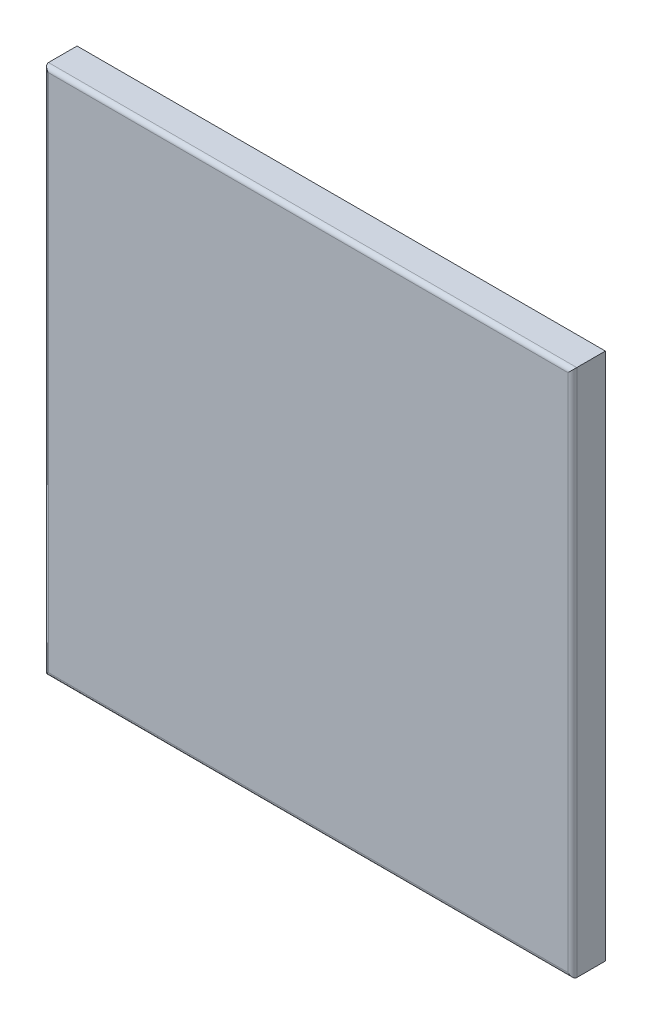
ISO-10303-21;
HEADER;
FILE_DESCRIPTION(('STEP AP214'),'2;1');
FILE_NAME('part.step','',(''),(''),'','','');
FILE_SCHEMA(('AUTOMOTIVE_DESIGN { 1 0 10303 214 1 1 1 1 }'));
ENDSEC;
DATA;
#1=APPLICATION_CONTEXT('core data for automotive mechanical design processes');
#2=APPLICATION_PROTOCOL_DEFINITION('international standard','automotive_design',2000,#1);
#3=PRODUCT_CONTEXT('',#1,'mechanical');
#4=PRODUCT('Part','Part','',(#3));
#5=PRODUCT_RELATED_PRODUCT_CATEGORY('part','',(#4));
#6=PRODUCT_DEFINITION_FORMATION('','',#4);
#7=PRODUCT_DEFINITION_CONTEXT('part definition',#1,'design');
#8=PRODUCT_DEFINITION('design','',#6,#7);
#9=PRODUCT_DEFINITION_SHAPE('','',#8);
#10=(LENGTH_UNIT() NAMED_UNIT(*) SI_UNIT(.MILLI.,.METRE.));
#11=(NAMED_UNIT(*) PLANE_ANGLE_UNIT() SI_UNIT($,.RADIAN.));
#12=(NAMED_UNIT(*) SI_UNIT($,.STERADIAN.) SOLID_ANGLE_UNIT());
#13=UNCERTAINTY_MEASURE_WITH_UNIT(LENGTH_MEASURE(1.E-05),#10,'distance_accuracy_value','');
#14=(GEOMETRIC_REPRESENTATION_CONTEXT(3) GLOBAL_UNCERTAINTY_ASSIGNED_CONTEXT((#13)) GLOBAL_UNIT_ASSIGNED_CONTEXT((#10,
#11,#12)) REPRESENTATION_CONTEXT('',''));
#15=CARTESIAN_POINT('',(0.,0.,0.));
#16=DIRECTION('',(0.,0.,1.));
#17=DIRECTION('',(1.,0.,0.));
#18=AXIS2_PLACEMENT_3D('',#15,#16,#17);
#19=CARTESIAN_POINT('',(152.4,-152.4,2.54));
#20=DIRECTION('',(-1.,0.,0.));
#21=DIRECTION('',(0.,0.,1.));
#22=AXIS2_PLACEMENT_3D('',#19,#20,#21);
#23=PLANE('',#22);
#24=DIRECTION('',(0.,0.,-1.));
#25=VECTOR('',#24,1.);
#26=CARTESIAN_POINT('',(152.4,152.4,2.54));
#27=LINE('',#26,#25);
#28=CARTESIAN_POINT('',(152.4,152.4,0.));
#29=VERTEX_POINT('',#28);
#30=CARTESIAN_POINT('',(152.4,152.4,-16.51));
#31=VERTEX_POINT('',#30);
#32=EDGE_CURVE('E169',#29,#31,#27,.T.);
#33=ORIENTED_EDGE('',*,*,#32,.F.);
#34=DIRECTION('',(0.,1.,0.));
#35=VECTOR('',#34,1.);
#36=CARTESIAN_POINT('',(152.4,-152.4,0.));
#37=LINE('',#36,#35);
#38=CARTESIAN_POINT('',(152.4,-152.4,0.));
#39=VERTEX_POINT('',#38);
#40=EDGE_CURVE('E196',#29,#39,#37,.F.);
#41=ORIENTED_EDGE('',*,*,#40,.T.);
#42=DIRECTION('',(0.,0.,-1.));
#43=VECTOR('',#42,1.);
#44=CARTESIAN_POINT('',(152.4,-152.4,2.54));
#45=LINE('',#44,#43);
#46=CARTESIAN_POINT('',(152.4,-152.4,-16.51));
#47=VERTEX_POINT('',#46);
#48=EDGE_CURVE('E163',#39,#47,#45,.T.);
#49=ORIENTED_EDGE('',*,*,#48,.T.);
#50=DIRECTION('',(0.,1.,0.));
#51=VECTOR('',#50,1.);
#52=CARTESIAN_POINT('',(152.4,-152.4,-16.51));
#53=LINE('',#52,#51);
#54=EDGE_CURVE('E153',#47,#31,#53,.T.);
#55=ORIENTED_EDGE('',*,*,#54,.T.);
#56=EDGE_LOOP('',(#33,#41,#49,#55));
#57=FACE_BOUND('',#56,.T.);
#58=ADVANCED_FACE('F33',(#57),#23,.F.);
#59=CARTESIAN_POINT('',(-152.4,152.4,2.54));
#60=DIRECTION('',(0.,-1.,0.));
#61=DIRECTION('',(0.,0.,-1.));
#62=AXIS2_PLACEMENT_3D('',#59,#60,#61);
#63=PLANE('',#62);
#64=DIRECTION('',(0.,0.,-1.));
#65=VECTOR('',#64,1.);
#66=CARTESIAN_POINT('',(-152.4,152.4,2.54));
#67=LINE('',#66,#65);
#68=CARTESIAN_POINT('',(-152.4,152.4,0.));
#69=VERTEX_POINT('',#68);
#70=CARTESIAN_POINT('',(-152.4,152.4,-16.51));
#71=VERTEX_POINT('',#70);
#72=EDGE_CURVE('E167',#69,#71,#67,.T.);
#73=ORIENTED_EDGE('',*,*,#72,.F.);
#74=DIRECTION('',(-1.,0.,0.));
#75=VECTOR('',#74,1.);
#76=CARTESIAN_POINT('',(-152.4,152.4,0.));
#77=LINE('',#76,#75);
#78=EDGE_CURVE('E194',#69,#29,#77,.F.);
#79=ORIENTED_EDGE('',*,*,#78,.T.);
#80=ORIENTED_EDGE('',*,*,#32,.T.);
#81=DIRECTION('',(-1.,0.,0.));
#82=VECTOR('',#81,1.);
#83=CARTESIAN_POINT('',(152.4,152.4,-16.51));
#84=LINE('',#83,#82);
#85=EDGE_CURVE('E157',#31,#71,#84,.T.);
#86=ORIENTED_EDGE('',*,*,#85,.T.);
#87=EDGE_LOOP('',(#73,#79,#80,#86));
#88=FACE_BOUND('',#87,.T.);
#89=ADVANCED_FACE('F240',(#88),#63,.F.);
#90=CARTESIAN_POINT('',(-152.4,-152.4,2.54));
#91=DIRECTION('',(1.,0.,0.));
#92=DIRECTION('',(0.,0.,-1.));
#93=AXIS2_PLACEMENT_3D('',#90,#91,#92);
#94=PLANE('',#93);
#95=DIRECTION('',(0.,0.,-1.));
#96=VECTOR('',#95,1.);
#97=CARTESIAN_POINT('',(-152.4,-152.4,2.54));
#98=LINE('',#97,#96);
#99=CARTESIAN_POINT('',(-152.4,-152.4,0.));
#100=VERTEX_POINT('',#99);
#101=CARTESIAN_POINT('',(-152.4,-152.4,-16.51));
#102=VERTEX_POINT('',#101);
#103=EDGE_CURVE('E165',#100,#102,#98,.T.);
#104=ORIENTED_EDGE('',*,*,#103,.F.);
#105=DIRECTION('',(0.,-1.,0.));
#106=VECTOR('',#105,1.);
#107=CARTESIAN_POINT('',(-152.4,-152.4,0.));
#108=LINE('',#107,#106);
#109=EDGE_CURVE('E192',#100,#69,#108,.F.);
#110=ORIENTED_EDGE('',*,*,#109,.T.);
#111=ORIENTED_EDGE('',*,*,#72,.T.);
#112=DIRECTION('',(0.,-1.,0.));
#113=VECTOR('',#112,1.);
#114=CARTESIAN_POINT('',(-152.4,152.4,-16.51));
#115=LINE('',#114,#113);
#116=EDGE_CURVE('E160',#71,#102,#115,.T.);
#117=ORIENTED_EDGE('',*,*,#116,.T.);
#118=EDGE_LOOP('',(#104,#110,#111,#117));
#119=FACE_BOUND('',#118,.T.);
#120=ADVANCED_FACE('F230',(#119),#94,.F.);
#121=CARTESIAN_POINT('',(-152.4,-152.4,2.54));
#122=DIRECTION('',(0.,1.,0.));
#123=DIRECTION('',(0.,0.,1.));
#124=AXIS2_PLACEMENT_3D('',#121,#122,#123);
#125=PLANE('',#124);
#126=ORIENTED_EDGE('',*,*,#48,.F.);
#127=DIRECTION('',(1.,0.,0.));
#128=VECTOR('',#127,1.);
#129=CARTESIAN_POINT('',(-152.4,-152.4,0.));
#130=LINE('',#129,#128);
#131=EDGE_CURVE('E189',#39,#100,#130,.F.);
#132=ORIENTED_EDGE('',*,*,#131,.T.);
#133=ORIENTED_EDGE('',*,*,#103,.T.);
#134=DIRECTION('',(1.,0.,0.));
#135=VECTOR('',#134,1.);
#136=CARTESIAN_POINT('',(-152.4,-152.4,-16.51));
#137=LINE('',#136,#135);
#138=CARTESIAN_POINT('',(-149.86,-152.4,-16.51));
#139=VERTEX_POINT('',#138);
#140=EDGE_CURVE('E150',#102,#139,#137,.T.);
#141=ORIENTED_EDGE('',*,*,#140,.T.);
#142=CARTESIAN_POINT('',(149.86,-152.4,-16.51));
#143=VERTEX_POINT('',#142);
#144=EDGE_CURVE('E154',#139,#143,#137,.T.);
#145=ORIENTED_EDGE('',*,*,#144,.T.);
#146=EDGE_CURVE('E138',#143,#47,#137,.T.);
#147=ORIENTED_EDGE('',*,*,#146,.T.);
#148=EDGE_LOOP('',(#126,#132,#133,#141,#145,#147));
#149=FACE_BOUND('',#148,.T.);
#150=ADVANCED_FACE('F227',(#149),#125,.F.);
#151=CARTESIAN_POINT('',(0.,0.,2.54));
#152=DIRECTION('',(0.,0.,-1.));
#153=DIRECTION('',(-1.,0.,0.));
#154=AXIS2_PLACEMENT_3D('',#151,#152,#153);
#155=PLANE('',#154);
#156=DIRECTION('',(0.,-1.,0.));
#157=VECTOR('',#156,1.);
#158=CARTESIAN_POINT('',(-149.86,0.,2.54));
#159=LINE('',#158,#157);
#160=CARTESIAN_POINT('',(-149.86,149.86,2.54));
#161=VERTEX_POINT('',#160);
#162=CARTESIAN_POINT('',(-149.86,-149.86,2.54));
#163=VERTEX_POINT('',#162);
#164=EDGE_CURVE('E184',#161,#163,#159,.T.);
#165=ORIENTED_EDGE('',*,*,#164,.T.);
#166=DIRECTION('',(1.,0.,0.));
#167=VECTOR('',#166,1.);
#168=CARTESIAN_POINT('',(0.,-149.86,2.54));
#169=LINE('',#168,#167);
#170=CARTESIAN_POINT('',(149.86,-149.86,2.54));
#171=VERTEX_POINT('',#170);
#172=EDGE_CURVE('E186',#163,#171,#169,.T.);
#173=ORIENTED_EDGE('',*,*,#172,.T.);
#174=DIRECTION('',(0.,1.,0.));
#175=VECTOR('',#174,1.);
#176=CARTESIAN_POINT('',(149.86,0.,2.54));
#177=LINE('',#176,#175);
#178=CARTESIAN_POINT('',(149.86,149.86,2.54));
#179=VERTEX_POINT('',#178);
#180=EDGE_CURVE('E180',#171,#179,#177,.T.);
#181=ORIENTED_EDGE('',*,*,#180,.T.);
#182=DIRECTION('',(-1.,0.,0.));
#183=VECTOR('',#182,1.);
#184=CARTESIAN_POINT('',(0.,149.86,2.54));
#185=LINE('',#184,#183);
#186=EDGE_CURVE('E182',#179,#161,#185,.T.);
#187=ORIENTED_EDGE('',*,*,#186,.T.);
#188=EDGE_LOOP('',(#165,#173,#181,#187));
#189=FACE_BOUND('',#188,.T.);
#190=ADVANCED_FACE('F217',(#189),#155,.F.);
#191=CARTESIAN_POINT('',(0.,0.,-16.51));
#192=DIRECTION('',(0.,0.,1.));
#193=DIRECTION('',(1.,0.,0.));
#194=AXIS2_PLACEMENT_3D('',#191,#192,#193);
#195=PLANE('',#194);
#196=ORIENTED_EDGE('',*,*,#146,.F.);
#197=DIRECTION('',(0.,1.,0.));
#198=VECTOR('',#197,1.);
#199=CARTESIAN_POINT('',(149.86,-149.86,-16.51));
#200=LINE('',#199,#198);
#201=CARTESIAN_POINT('',(149.86,149.86,-16.51));
#202=VERTEX_POINT('',#201);
#203=EDGE_CURVE('E119',#143,#202,#200,.T.);
#204=ORIENTED_EDGE('',*,*,#203,.T.);
#205=DIRECTION('',(-1.,0.,0.));
#206=VECTOR('',#205,1.);
#207=CARTESIAN_POINT('',(149.86,149.86,-16.51));
#208=LINE('',#207,#206);
#209=CARTESIAN_POINT('',(-149.86,149.86,-16.51));
#210=VERTEX_POINT('',#209);
#211=EDGE_CURVE('E129',#202,#210,#208,.T.);
#212=ORIENTED_EDGE('',*,*,#211,.T.);
#213=DIRECTION('',(0.,-1.,0.));
#214=VECTOR('',#213,1.);
#215=CARTESIAN_POINT('',(-149.86,149.86,-16.51));
#216=LINE('',#215,#214);
#217=EDGE_CURVE('E125',#210,#139,#216,.T.);
#218=ORIENTED_EDGE('',*,*,#217,.T.);
#219=ORIENTED_EDGE('',*,*,#140,.F.);
#220=ORIENTED_EDGE('',*,*,#116,.F.);
#221=ORIENTED_EDGE('',*,*,#85,.F.);
#222=ORIENTED_EDGE('',*,*,#54,.F.);
#223=EDGE_LOOP('',(#196,#204,#212,#218,#219,#220,#221,#222));
#224=FACE_BOUND('',#223,.T.);
#225=ADVANCED_FACE('F135',(#224),#195,.F.);
#226=CARTESIAN_POINT('',(149.86,-149.86,-16.51));
#227=DIRECTION('',(1.,0.,0.));
#228=DIRECTION('',(0.,0.,-1.));
#229=AXIS2_PLACEMENT_3D('',#226,#227,#228);
#230=PLANE('',#229);
#231=DIRECTION('',(0.,-1.,0.));
#232=VECTOR('',#231,1.);
#233=CARTESIAN_POINT('',(149.86,0.,0.));
#234=LINE('',#233,#232);
#235=CARTESIAN_POINT('',(149.86,149.86,0.));
#236=VERTEX_POINT('',#235);
#237=CARTESIAN_POINT('',(149.86,-149.86,0.));
#238=VERTEX_POINT('',#237);
#239=EDGE_CURVE('E121',#236,#238,#234,.T.);
#240=ORIENTED_EDGE('',*,*,#239,.F.);
#241=DIRECTION('',(0.,0.,1.));
#242=VECTOR('',#241,1.);
#243=CARTESIAN_POINT('',(149.86,149.86,-16.51));
#244=LINE('',#243,#242);
#245=EDGE_CURVE('E115',#202,#236,#244,.T.);
#246=ORIENTED_EDGE('',*,*,#245,.F.);
#247=ORIENTED_EDGE('',*,*,#203,.F.);
#248=CARTESIAN_POINT('',(149.86,-152.4,-13.97));
#249=DIRECTION('',(1.,0.,0.));
#250=DIRECTION('',(0.,0.,-1.));
#251=AXIS2_PLACEMENT_3D('',#248,#249,#250);
#252=CIRCLE('',#251,2.54);
#253=CARTESIAN_POINT('',(149.86,-149.86,-13.97));
#254=VERTEX_POINT('',#253);
#255=EDGE_CURVE('E42',#143,#254,#252,.T.);
#256=ORIENTED_EDGE('',*,*,#255,.T.);
#257=DIRECTION('',(0.,0.,1.));
#258=VECTOR('',#257,1.);
#259=CARTESIAN_POINT('',(149.86,-149.86,-16.51));
#260=LINE('',#259,#258);
#261=EDGE_CURVE('E145',#254,#238,#260,.T.);
#262=ORIENTED_EDGE('',*,*,#261,.T.);
#263=EDGE_LOOP('',(#240,#246,#247,#256,#262));
#264=FACE_BOUND('',#263,.T.);
#265=ADVANCED_FACE('F117',(#264),#230,.F.);
#266=CARTESIAN_POINT('',(-149.86,-149.86,-16.51));
#267=DIRECTION('',(0.,-1.,0.));
#268=DIRECTION('',(1.,0.,0.));
#269=AXIS2_PLACEMENT_3D('',#266,#267,#268);
#270=PLANE('',#269);
#271=ORIENTED_EDGE('',*,*,#261,.F.);
#272=DIRECTION('',(1.,0.,0.));
#273=VECTOR('',#272,1.);
#274=CARTESIAN_POINT('',(-149.86,-149.86,-13.97));
#275=LINE('',#274,#273);
#276=CARTESIAN_POINT('',(-149.86,-149.86,-13.97));
#277=VERTEX_POINT('',#276);
#278=EDGE_CURVE('E50',#254,#277,#275,.F.);
#279=ORIENTED_EDGE('',*,*,#278,.T.);
#280=DIRECTION('',(0.,0.,1.));
#281=VECTOR('',#280,1.);
#282=CARTESIAN_POINT('',(-149.86,-149.86,-16.51));
#283=LINE('',#282,#281);
#284=CARTESIAN_POINT('',(-149.86,-149.86,0.));
#285=VERTEX_POINT('',#284);
#286=EDGE_CURVE('E147',#277,#285,#283,.T.);
#287=ORIENTED_EDGE('',*,*,#286,.T.);
#288=DIRECTION('',(-1.,0.,0.));
#289=VECTOR('',#288,1.);
#290=CARTESIAN_POINT('',(0.,-149.86,0.));
#291=LINE('',#290,#289);
#292=EDGE_CURVE('E176',#238,#285,#291,.T.);
#293=ORIENTED_EDGE('',*,*,#292,.F.);
#294=EDGE_LOOP('',(#271,#279,#287,#293));
#295=FACE_BOUND('',#294,.T.);
#296=ADVANCED_FACE('F282',(#295),#270,.F.);
#297=CARTESIAN_POINT('',(-149.86,149.86,-16.51));
#298=DIRECTION('',(-1.,0.,0.));
#299=DIRECTION('',(0.,-1.,0.));
#300=AXIS2_PLACEMENT_3D('',#297,#298,#299);
#301=PLANE('',#300);
#302=DIRECTION('',(0.,1.,0.));
#303=VECTOR('',#302,1.);
#304=CARTESIAN_POINT('',(-149.86,0.,0.));
#305=LINE('',#304,#303);
#306=CARTESIAN_POINT('',(-149.86,149.86,0.));
#307=VERTEX_POINT('',#306);
#308=EDGE_CURVE('E173',#285,#307,#305,.T.);
#309=ORIENTED_EDGE('',*,*,#308,.F.);
#310=ORIENTED_EDGE('',*,*,#286,.F.);
#311=CARTESIAN_POINT('',(-149.86,-152.4,-13.97));
#312=DIRECTION('',(-1.,0.,0.));
#313=DIRECTION('',(0.,-1.,0.));
#314=AXIS2_PLACEMENT_3D('',#311,#312,#313);
#315=CIRCLE('',#314,2.54);
#316=EDGE_CURVE('E11',#277,#139,#315,.T.);
#317=ORIENTED_EDGE('',*,*,#316,.T.);
#318=ORIENTED_EDGE('',*,*,#217,.F.);
#319=DIRECTION('',(0.,0.,1.));
#320=VECTOR('',#319,1.);
#321=CARTESIAN_POINT('',(-149.86,149.86,-16.51));
#322=LINE('',#321,#320);
#323=EDGE_CURVE('E124',#210,#307,#322,.T.);
#324=ORIENTED_EDGE('',*,*,#323,.T.);
#325=EDGE_LOOP('',(#309,#310,#317,#318,#324));
#326=FACE_BOUND('',#325,.T.);
#327=ADVANCED_FACE('F268',(#326),#301,.F.);
#328=CARTESIAN_POINT('',(149.86,149.86,-16.51));
#329=DIRECTION('',(0.,1.,0.));
#330=DIRECTION('',(-1.,0.,0.));
#331=AXIS2_PLACEMENT_3D('',#328,#329,#330);
#332=PLANE('',#331);
#333=DIRECTION('',(1.,0.,0.));
#334=VECTOR('',#333,1.);
#335=CARTESIAN_POINT('',(0.,149.86,0.));
#336=LINE('',#335,#334);
#337=EDGE_CURVE('E171',#307,#236,#336,.T.);
#338=ORIENTED_EDGE('',*,*,#337,.F.);
#339=ORIENTED_EDGE('',*,*,#323,.F.);
#340=ORIENTED_EDGE('',*,*,#211,.F.);
#341=ORIENTED_EDGE('',*,*,#245,.T.);
#342=EDGE_LOOP('',(#338,#339,#340,#341));
#343=FACE_BOUND('',#342,.T.);
#344=ADVANCED_FACE('F130',(#343),#332,.F.);
#345=CARTESIAN_POINT('',(0.,0.,0.));
#346=DIRECTION('',(0.,0.,-1.));
#347=DIRECTION('',(-1.,0.,0.));
#348=AXIS2_PLACEMENT_3D('',#345,#346,#347);
#349=PLANE('',#348);
#350=ORIENTED_EDGE('',*,*,#337,.T.);
#351=ORIENTED_EDGE('',*,*,#239,.T.);
#352=ORIENTED_EDGE('',*,*,#292,.T.);
#353=ORIENTED_EDGE('',*,*,#308,.T.);
#354=EDGE_LOOP('',(#350,#351,#352,#353));
#355=FACE_BOUND('',#354,.T.);
#356=ADVANCED_FACE('F259',(#355),#349,.T.);
#357=CARTESIAN_POINT('',(0.,149.86,0.));
#358=DIRECTION('',(-1.,0.,0.));
#359=DIRECTION('',(0.,0.,1.));
#360=AXIS2_PLACEMENT_3D('',#357,#358,#359);
#361=CYLINDRICAL_SURFACE('',#360,2.54);
#362=CARTESIAN_POINT('',(149.86,149.86,0.));
#363=DIRECTION('',(-0.707106781186547,0.707106781186547,0.));
#364=DIRECTION('',(0.707106781186547,0.707106781186547,0.));
#365=AXIS2_PLACEMENT_3D('',#362,#363,#364);
#366=ELLIPSE('',#365,3.59210244842766,2.54);
#367=EDGE_CURVE('E142',#29,#179,#366,.F.);
#368=ORIENTED_EDGE('',*,*,#367,.F.);
#369=ORIENTED_EDGE('',*,*,#78,.F.);
#370=CARTESIAN_POINT('',(-149.86,149.86,0.));
#371=DIRECTION('',(-0.707106781186547,-0.707106781186547,0.));
#372=DIRECTION('',(-0.707106781186547,0.707106781186547,0.));
#373=AXIS2_PLACEMENT_3D('',#370,#371,#372);
#374=ELLIPSE('',#373,3.59210244842766,2.54);
#375=EDGE_CURVE('E37',#161,#69,#374,.T.);
#376=ORIENTED_EDGE('',*,*,#375,.F.);
#377=ORIENTED_EDGE('',*,*,#186,.F.);
#378=EDGE_LOOP('',(#368,#369,#376,#377));
#379=FACE_BOUND('',#378,.T.);
#380=ADVANCED_FACE('F213',(#379),#361,.T.);
#381=CARTESIAN_POINT('',(-149.86,0.,0.));
#382=DIRECTION('',(0.,-1.,0.));
#383=DIRECTION('',(0.,0.,-1.));
#384=AXIS2_PLACEMENT_3D('',#381,#382,#383);
#385=CYLINDRICAL_SURFACE('',#384,2.54);
#386=ORIENTED_EDGE('',*,*,#375,.T.);
#387=ORIENTED_EDGE('',*,*,#109,.F.);
#388=CARTESIAN_POINT('',(-149.86,-149.86,0.));
#389=DIRECTION('',(0.707106781186547,-0.707106781186547,0.));
#390=DIRECTION('',(-0.707106781186547,-0.707106781186547,0.));
#391=AXIS2_PLACEMENT_3D('',#388,#389,#390);
#392=ELLIPSE('',#391,3.59210244842766,2.54);
#393=EDGE_CURVE('E202',#163,#100,#392,.T.);
#394=ORIENTED_EDGE('',*,*,#393,.F.);
#395=ORIENTED_EDGE('',*,*,#164,.F.);
#396=EDGE_LOOP('',(#386,#387,#394,#395));
#397=FACE_BOUND('',#396,.T.);
#398=ADVANCED_FACE('F255',(#397),#385,.T.);
#399=CARTESIAN_POINT('',(149.86,0.,0.));
#400=DIRECTION('',(0.,1.,0.));
#401=DIRECTION('',(0.,0.,1.));
#402=AXIS2_PLACEMENT_3D('',#399,#400,#401);
#403=CYLINDRICAL_SURFACE('',#402,2.54);
#404=ORIENTED_EDGE('',*,*,#367,.T.);
#405=ORIENTED_EDGE('',*,*,#180,.F.);
#406=CARTESIAN_POINT('',(149.86,-149.86,0.));
#407=DIRECTION('',(0.707106781186547,0.707106781186547,0.));
#408=DIRECTION('',(-0.707106781186547,0.707106781186547,0.));
#409=AXIS2_PLACEMENT_3D('',#406,#407,#408);
#410=ELLIPSE('',#409,3.59210244842766,2.54);
#411=EDGE_CURVE('E200',#39,#171,#410,.F.);
#412=ORIENTED_EDGE('',*,*,#411,.F.);
#413=ORIENTED_EDGE('',*,*,#40,.F.);
#414=EDGE_LOOP('',(#404,#405,#412,#413));
#415=FACE_BOUND('',#414,.T.);
#416=ADVANCED_FACE('F208',(#415),#403,.T.);
#417=CARTESIAN_POINT('',(0.,-149.86,0.));
#418=DIRECTION('',(1.,0.,0.));
#419=DIRECTION('',(0.,0.,-1.));
#420=AXIS2_PLACEMENT_3D('',#417,#418,#419);
#421=CYLINDRICAL_SURFACE('',#420,2.54);
#422=ORIENTED_EDGE('',*,*,#393,.T.);
#423=ORIENTED_EDGE('',*,*,#131,.F.);
#424=ORIENTED_EDGE('',*,*,#411,.T.);
#425=ORIENTED_EDGE('',*,*,#172,.F.);
#426=EDGE_LOOP('',(#422,#423,#424,#425));
#427=FACE_BOUND('',#426,.T.);
#428=ADVANCED_FACE('F221',(#427),#421,.T.);
#429=CARTESIAN_POINT('',(0.,-152.4,-13.97));
#430=DIRECTION('',(1.,0.,0.));
#431=DIRECTION('',(0.,1.,0.));
#432=AXIS2_PLACEMENT_3D('',#429,#430,#431);
#433=CYLINDRICAL_SURFACE('',#432,2.54);
#434=ORIENTED_EDGE('',*,*,#316,.F.);
#435=ORIENTED_EDGE('',*,*,#278,.F.);
#436=ORIENTED_EDGE('',*,*,#255,.F.);
#437=ORIENTED_EDGE('',*,*,#144,.F.);
#438=EDGE_LOOP('',(#434,#435,#436,#437));
#439=FACE_BOUND('',#438,.T.);
#440=ADVANCED_FACE('F35',(#439),#433,.T.);
#441=CLOSED_SHELL('',(#58,#89,#120,#150,#190,#225,#265,#296,#327,#344,#356,#380,#398,#416,#428,#440));
#442=MANIFOLD_SOLID_BREP('B2',#441);
#443=ADVANCED_BREP_SHAPE_REPRESENTATION('',(#18,#442),#14);
#444=SHAPE_DEFINITION_REPRESENTATION(#9,#443);
ENDSEC;
END-ISO-10303-21;
